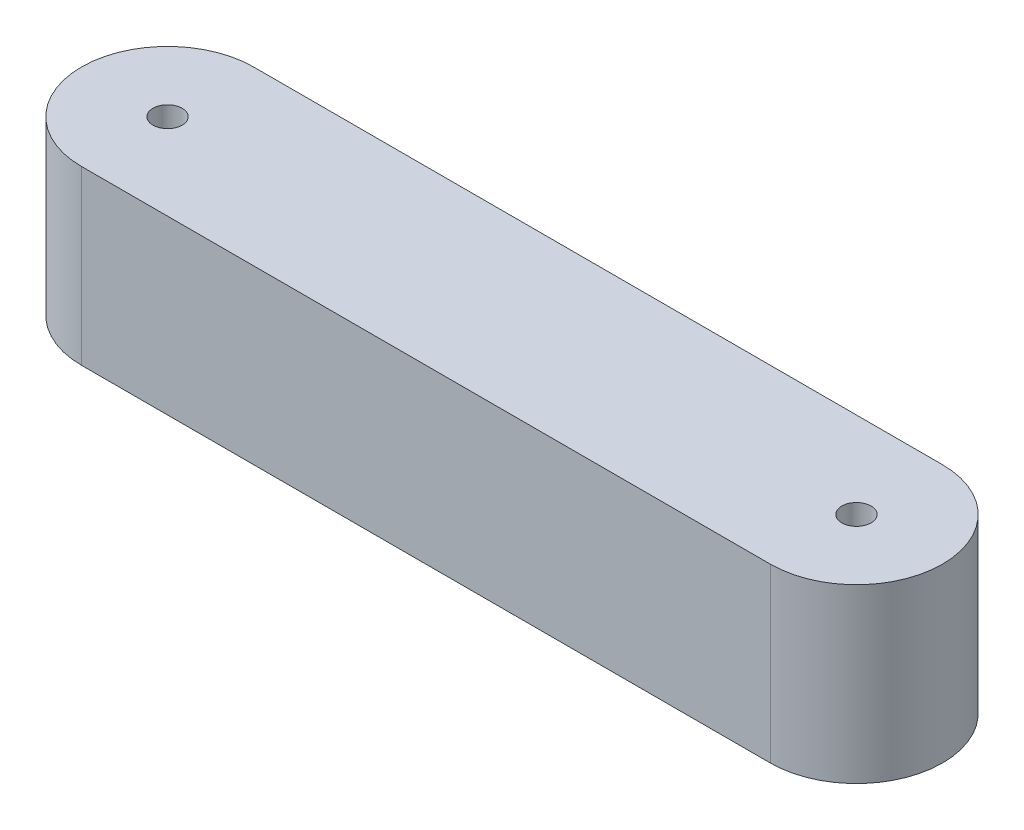
ISO-10303-21;
HEADER;
FILE_DESCRIPTION(('STEP AP214'),'2;1');
FILE_NAME('part.step','',(''),(''),'','','');
FILE_SCHEMA(('AUTOMOTIVE_DESIGN { 1 0 10303 214 1 1 1 1 }'));
ENDSEC;
DATA;
#1=APPLICATION_CONTEXT('core data for automotive mechanical design processes');
#2=APPLICATION_PROTOCOL_DEFINITION('international standard','automotive_design',2000,#1);
#3=PRODUCT_CONTEXT('',#1,'mechanical');
#4=PRODUCT('Part','Part','',(#3));
#5=PRODUCT_RELATED_PRODUCT_CATEGORY('part','',(#4));
#6=PRODUCT_DEFINITION_FORMATION('','',#4);
#7=PRODUCT_DEFINITION_CONTEXT('part definition',#1,'design');
#8=PRODUCT_DEFINITION('design','',#6,#7);
#9=PRODUCT_DEFINITION_SHAPE('','',#8);
#10=(LENGTH_UNIT() NAMED_UNIT(*) SI_UNIT(.MILLI.,.METRE.));
#11=(NAMED_UNIT(*) PLANE_ANGLE_UNIT() SI_UNIT($,.RADIAN.));
#12=(NAMED_UNIT(*) SI_UNIT($,.STERADIAN.) SOLID_ANGLE_UNIT());
#13=UNCERTAINTY_MEASURE_WITH_UNIT(LENGTH_MEASURE(1.E-05),#10,'distance_accuracy_value','');
#14=(GEOMETRIC_REPRESENTATION_CONTEXT(3) GLOBAL_UNCERTAINTY_ASSIGNED_CONTEXT((#13)) GLOBAL_UNIT_ASSIGNED_CONTEXT((#10,
#11,#12)) REPRESENTATION_CONTEXT('',''));
#15=CARTESIAN_POINT('',(0.,0.,0.));
#16=DIRECTION('',(0.,0.,1.));
#17=DIRECTION('',(1.,0.,0.));
#18=AXIS2_PLACEMENT_3D('',#15,#16,#17);
#19=CARTESIAN_POINT('',(-40.,20.,0.));
#20=DIRECTION('',(0.,1.,0.));
#21=DIRECTION('',(0.,0.,1.));
#22=AXIS2_PLACEMENT_3D('',#19,#20,#21);
#23=PLANE('',#22);
#24=CARTESIAN_POINT('',(-40.,20.,0.));
#25=DIRECTION('',(0.,1.,0.));
#26=DIRECTION('',(0.,0.,1.));
#27=AXIS2_PLACEMENT_3D('',#24,#25,#26);
#28=CIRCLE('',#27,1.7);
#29=CARTESIAN_POINT('',(-40.,20.,1.7));
#30=VERTEX_POINT('',#29);
#31=EDGE_CURVE('E120',#30,#30,#28,.T.);
#32=ORIENTED_EDGE('',*,*,#31,.F.);
#33=EDGE_LOOP('',(#32));
#34=FACE_BOUND('',#33,.T.);
#35=CARTESIAN_POINT('',(-40.,20.,0.));
#36=DIRECTION('',(0.,1.,0.));
#37=DIRECTION('',(0.,0.,1.));
#38=AXIS2_PLACEMENT_3D('',#35,#36,#37);
#39=CIRCLE('',#38,10.);
#40=CARTESIAN_POINT('',(-40.,20.,-10.));
#41=VERTEX_POINT('',#40);
#42=CARTESIAN_POINT('',(-40.,20.,10.));
#43=VERTEX_POINT('',#42);
#44=EDGE_CURVE('E100',#41,#43,#39,.T.);
#45=ORIENTED_EDGE('',*,*,#44,.T.);
#46=DIRECTION('',(1.,0.,0.));
#47=VECTOR('',#46,1.);
#48=CARTESIAN_POINT('',(-40.,20.,10.));
#49=LINE('',#48,#47);
#50=CARTESIAN_POINT('',(40.,20.,9.99999999999999));
#51=VERTEX_POINT('',#50);
#52=EDGE_CURVE('E95',#43,#51,#49,.T.);
#53=ORIENTED_EDGE('',*,*,#52,.T.);
#54=CARTESIAN_POINT('',(40.,20.,0.));
#55=DIRECTION('',(0.,1.,0.));
#56=DIRECTION('',(0.,0.,1.));
#57=AXIS2_PLACEMENT_3D('',#54,#55,#56);
#58=CIRCLE('',#57,10.);
#59=CARTESIAN_POINT('',(40.,20.,-10.));
#60=VERTEX_POINT('',#59);
#61=EDGE_CURVE('E98',#51,#60,#58,.T.);
#62=ORIENTED_EDGE('',*,*,#61,.T.);
#63=DIRECTION('',(-1.,0.,0.));
#64=VECTOR('',#63,1.);
#65=CARTESIAN_POINT('',(-40.,20.,-10.));
#66=LINE('',#65,#64);
#67=EDGE_CURVE('E65',#60,#41,#66,.T.);
#68=ORIENTED_EDGE('',*,*,#67,.T.);
#69=EDGE_LOOP('',(#45,#53,#62,#68));
#70=FACE_BOUND('',#69,.T.);
#71=CARTESIAN_POINT('',(40.,20.,0.));
#72=DIRECTION('',(0.,1.,0.));
#73=DIRECTION('',(0.,0.,1.));
#74=AXIS2_PLACEMENT_3D('',#71,#72,#73);
#75=CIRCLE('',#74,1.7);
#76=CARTESIAN_POINT('',(40.,20.,1.69999999999998));
#77=VERTEX_POINT('',#76);
#78=EDGE_CURVE('E142',#77,#77,#75,.T.);
#79=ORIENTED_EDGE('',*,*,#78,.F.);
#80=EDGE_LOOP('',(#79));
#81=FACE_BOUND('',#80,.T.);
#82=ADVANCED_FACE('F47',(#34,#70,#81),#23,.T.);
#83=CARTESIAN_POINT('',(-40.,0.,0.));
#84=DIRECTION('',(0.,1.,0.));
#85=DIRECTION('',(0.,0.,1.));
#86=AXIS2_PLACEMENT_3D('',#83,#84,#85);
#87=PLANE('',#86);
#88=CARTESIAN_POINT('',(-40.,0.,0.));
#89=DIRECTION('',(0.,1.,0.));
#90=DIRECTION('',(0.,0.,1.));
#91=AXIS2_PLACEMENT_3D('',#88,#89,#90);
#92=CIRCLE('',#91,10.);
#93=CARTESIAN_POINT('',(-40.,0.,-10.));
#94=VERTEX_POINT('',#93);
#95=CARTESIAN_POINT('',(-40.,0.,10.));
#96=VERTEX_POINT('',#95);
#97=EDGE_CURVE('E116',#94,#96,#92,.T.);
#98=ORIENTED_EDGE('',*,*,#97,.F.);
#99=DIRECTION('',(-1.,0.,0.));
#100=VECTOR('',#99,1.);
#101=CARTESIAN_POINT('',(-40.,0.,-10.));
#102=LINE('',#101,#100);
#103=CARTESIAN_POINT('',(40.,0.,-10.));
#104=VERTEX_POINT('',#103);
#105=EDGE_CURVE('E88',#104,#94,#102,.T.);
#106=ORIENTED_EDGE('',*,*,#105,.F.);
#107=CARTESIAN_POINT('',(40.,0.,0.));
#108=DIRECTION('',(0.,1.,0.));
#109=DIRECTION('',(0.,0.,1.));
#110=AXIS2_PLACEMENT_3D('',#107,#108,#109);
#111=CIRCLE('',#110,10.);
#112=CARTESIAN_POINT('',(40.,0.,9.99999999999999));
#113=VERTEX_POINT('',#112);
#114=EDGE_CURVE('E82',#113,#104,#111,.T.);
#115=ORIENTED_EDGE('',*,*,#114,.F.);
#116=DIRECTION('',(1.,0.,0.));
#117=VECTOR('',#116,1.);
#118=CARTESIAN_POINT('',(-40.,0.,10.));
#119=LINE('',#118,#117);
#120=EDGE_CURVE('E105',#96,#113,#119,.T.);
#121=ORIENTED_EDGE('',*,*,#120,.F.);
#122=EDGE_LOOP('',(#98,#106,#115,#121));
#123=FACE_BOUND('',#122,.T.);
#124=CARTESIAN_POINT('',(-40.,0.,0.));
#125=DIRECTION('',(0.,1.,0.));
#126=DIRECTION('',(0.,0.,1.));
#127=AXIS2_PLACEMENT_3D('',#124,#125,#126);
#128=CIRCLE('',#127,1.7);
#129=CARTESIAN_POINT('',(-40.,0.,1.7));
#130=VERTEX_POINT('',#129);
#131=EDGE_CURVE('E138',#130,#130,#128,.T.);
#132=ORIENTED_EDGE('',*,*,#131,.T.);
#133=EDGE_LOOP('',(#132));
#134=FACE_BOUND('',#133,.T.);
#135=CARTESIAN_POINT('',(40.,0.,0.));
#136=DIRECTION('',(0.,1.,0.));
#137=DIRECTION('',(0.,0.,1.));
#138=AXIS2_PLACEMENT_3D('',#135,#136,#137);
#139=CIRCLE('',#138,1.7);
#140=CARTESIAN_POINT('',(40.,0.,1.69999999999998));
#141=VERTEX_POINT('',#140);
#142=EDGE_CURVE('E146',#141,#141,#139,.T.);
#143=ORIENTED_EDGE('',*,*,#142,.T.);
#144=EDGE_LOOP('',(#143));
#145=FACE_BOUND('',#144,.T.);
#146=ADVANCED_FACE('F133',(#123,#134,#145),#87,.F.);
#147=CARTESIAN_POINT('',(-40.,20.,0.));
#148=DIRECTION('',(0.,-1.,0.));
#149=DIRECTION('',(0.,0.,-1.));
#150=AXIS2_PLACEMENT_3D('',#147,#148,#149);
#151=CYLINDRICAL_SURFACE('',#150,10.);
#152=ORIENTED_EDGE('',*,*,#97,.T.);
#153=DIRECTION('',(0.,-1.,0.));
#154=VECTOR('',#153,1.);
#155=CARTESIAN_POINT('',(-40.,20.,10.));
#156=LINE('',#155,#154);
#157=EDGE_CURVE('E11',#43,#96,#156,.T.);
#158=ORIENTED_EDGE('',*,*,#157,.F.);
#159=ORIENTED_EDGE('',*,*,#44,.F.);
#160=DIRECTION('',(0.,-1.,0.));
#161=VECTOR('',#160,1.);
#162=CARTESIAN_POINT('',(-40.,20.,-10.));
#163=LINE('',#162,#161);
#164=EDGE_CURVE('E112',#41,#94,#163,.T.);
#165=ORIENTED_EDGE('',*,*,#164,.T.);
#166=EDGE_LOOP('',(#152,#158,#159,#165));
#167=FACE_BOUND('',#166,.T.);
#168=ADVANCED_FACE('F49',(#167),#151,.T.);
#169=CARTESIAN_POINT('',(-40.,20.,10.));
#170=DIRECTION('',(0.,0.,-1.));
#171=DIRECTION('',(-1.,0.,0.));
#172=AXIS2_PLACEMENT_3D('',#169,#170,#171);
#173=PLANE('',#172);
#174=ORIENTED_EDGE('',*,*,#120,.T.);
#175=DIRECTION('',(0.,-1.,0.));
#176=VECTOR('',#175,1.);
#177=CARTESIAN_POINT('',(40.,20.,9.99999999999999));
#178=LINE('',#177,#176);
#179=EDGE_CURVE('E57',#51,#113,#178,.T.);
#180=ORIENTED_EDGE('',*,*,#179,.F.);
#181=ORIENTED_EDGE('',*,*,#52,.F.);
#182=ORIENTED_EDGE('',*,*,#157,.T.);
#183=EDGE_LOOP('',(#174,#180,#181,#182));
#184=FACE_BOUND('',#183,.T.);
#185=ADVANCED_FACE('F104',(#184),#173,.F.);
#186=CARTESIAN_POINT('',(40.,20.,0.));
#187=DIRECTION('',(0.,-1.,0.));
#188=DIRECTION('',(0.,0.,-1.));
#189=AXIS2_PLACEMENT_3D('',#186,#187,#188);
#190=CYLINDRICAL_SURFACE('',#189,10.);
#191=ORIENTED_EDGE('',*,*,#114,.T.);
#192=DIRECTION('',(0.,-1.,0.));
#193=VECTOR('',#192,1.);
#194=CARTESIAN_POINT('',(40.,20.,-10.));
#195=LINE('',#194,#193);
#196=EDGE_CURVE('E107',#60,#104,#195,.T.);
#197=ORIENTED_EDGE('',*,*,#196,.F.);
#198=ORIENTED_EDGE('',*,*,#61,.F.);
#199=ORIENTED_EDGE('',*,*,#179,.T.);
#200=EDGE_LOOP('',(#191,#197,#198,#199));
#201=FACE_BOUND('',#200,.T.);
#202=ADVANCED_FACE('F108',(#201),#190,.T.);
#203=CARTESIAN_POINT('',(-40.,20.,-10.));
#204=DIRECTION('',(0.,0.,1.));
#205=DIRECTION('',(1.,0.,0.));
#206=AXIS2_PLACEMENT_3D('',#203,#204,#205);
#207=PLANE('',#206);
#208=ORIENTED_EDGE('',*,*,#105,.T.);
#209=ORIENTED_EDGE('',*,*,#164,.F.);
#210=ORIENTED_EDGE('',*,*,#67,.F.);
#211=ORIENTED_EDGE('',*,*,#196,.T.);
#212=EDGE_LOOP('',(#208,#209,#210,#211));
#213=FACE_BOUND('',#212,.T.);
#214=ADVANCED_FACE('F130',(#213),#207,.F.);
#215=CARTESIAN_POINT('',(-40.,20.,0.));
#216=DIRECTION('',(0.,-1.,0.));
#217=DIRECTION('',(0.,0.,-1.));
#218=AXIS2_PLACEMENT_3D('',#215,#216,#217);
#219=CYLINDRICAL_SURFACE('',#218,1.7);
#220=ORIENTED_EDGE('',*,*,#31,.T.);
#221=EDGE_LOOP('',(#220));
#222=FACE_BOUND('',#221,.T.);
#223=ORIENTED_EDGE('',*,*,#131,.F.);
#224=EDGE_LOOP('',(#223));
#225=FACE_BOUND('',#224,.T.);
#226=ADVANCED_FACE('F165',(#222,#225),#219,.F.);
#227=CARTESIAN_POINT('',(40.,20.,0.));
#228=DIRECTION('',(0.,-1.,0.));
#229=DIRECTION('',(0.,0.,-1.));
#230=AXIS2_PLACEMENT_3D('',#227,#228,#229);
#231=CYLINDRICAL_SURFACE('',#230,1.7);
#232=ORIENTED_EDGE('',*,*,#78,.T.);
#233=EDGE_LOOP('',(#232));
#234=FACE_BOUND('',#233,.T.);
#235=ORIENTED_EDGE('',*,*,#142,.F.);
#236=EDGE_LOOP('',(#235));
#237=FACE_BOUND('',#236,.T.);
#238=ADVANCED_FACE('F154',(#234,#237),#231,.F.);
#239=CLOSED_SHELL('',(#82,#146,#168,#185,#202,#214,#226,#238));
#240=MANIFOLD_SOLID_BREP('B2',#239);
#241=ADVANCED_BREP_SHAPE_REPRESENTATION('',(#18,#240),#14);
#242=SHAPE_DEFINITION_REPRESENTATION(#9,#241);
ENDSEC;
END-ISO-10303-21;
